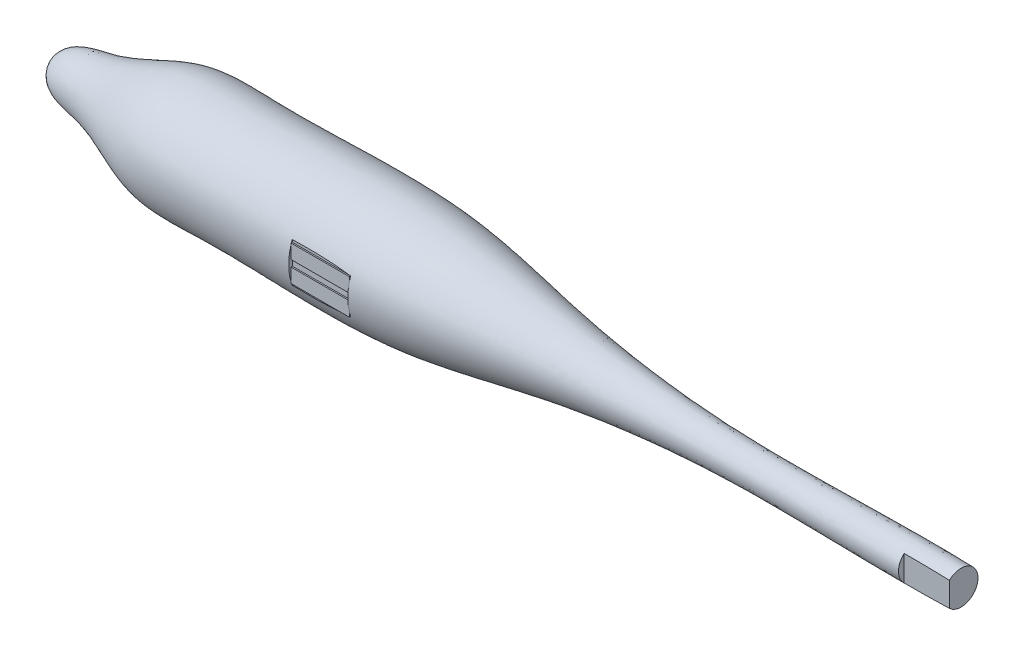
ISO-10303-21;
HEADER;
FILE_DESCRIPTION(('STEP AP214'),'2;1');
FILE_NAME('part.step','',(''),(''),'','','');
FILE_SCHEMA(('AUTOMOTIVE_DESIGN { 1 0 10303 214 1 1 1 1 }'));
ENDSEC;
DATA;
#1=APPLICATION_CONTEXT('core data for automotive mechanical design processes');
#2=APPLICATION_PROTOCOL_DEFINITION('international standard','automotive_design',2000,#1);
#3=PRODUCT_CONTEXT('',#1,'mechanical');
#4=PRODUCT('Part','Part','',(#3));
#5=PRODUCT_RELATED_PRODUCT_CATEGORY('part','',(#4));
#6=PRODUCT_DEFINITION_FORMATION('','',#4);
#7=PRODUCT_DEFINITION_CONTEXT('part definition',#1,'design');
#8=PRODUCT_DEFINITION('design','',#6,#7);
#9=PRODUCT_DEFINITION_SHAPE('','',#8);
#10=(LENGTH_UNIT() NAMED_UNIT(*) SI_UNIT(.MILLI.,.METRE.));
#11=(NAMED_UNIT(*) PLANE_ANGLE_UNIT() SI_UNIT($,.RADIAN.));
#12=(NAMED_UNIT(*) SI_UNIT($,.STERADIAN.) SOLID_ANGLE_UNIT());
#13=UNCERTAINTY_MEASURE_WITH_UNIT(LENGTH_MEASURE(1.E-05),#10,'distance_accuracy_value','');
#14=(GEOMETRIC_REPRESENTATION_CONTEXT(3) GLOBAL_UNCERTAINTY_ASSIGNED_CONTEXT((#13)) GLOBAL_UNIT_ASSIGNED_CONTEXT((#10,
#11,#12)) REPRESENTATION_CONTEXT('',''));
#15=CARTESIAN_POINT('',(0.,0.,0.));
#16=DIRECTION('',(0.,0.,1.));
#17=DIRECTION('',(1.,0.,0.));
#18=AXIS2_PLACEMENT_3D('',#15,#16,#17);
#19=CARTESIAN_POINT('',(450.,100.,81.5));
#20=DIRECTION('',(-1.,0.,0.));
#21=DIRECTION('',(0.,0.,1.));
#22=AXIS2_PLACEMENT_3D('',#19,#20,#21);
#23=PLANE('',#22);
#24=DIRECTION('',(0.,-1.,0.));
#25=VECTOR('',#24,1.);
#26=CARTESIAN_POINT('',(450.,100.,81.5));
#27=LINE('',#26,#25);
#28=CARTESIAN_POINT('',(450.,-27.045196906397,81.5));
#29=VERTEX_POINT('',#28);
#30=CARTESIAN_POINT('',(450.,-30.5882634477406,81.5));
#31=VERTEX_POINT('',#30);
#32=EDGE_CURVE('E250',#29,#31,#27,.T.);
#33=ORIENTED_EDGE('',*,*,#32,.F.);
#34=DIRECTION('',(0.,0.,-1.));
#35=VECTOR('',#34,1.);
#36=CARTESIAN_POINT('',(450.,-27.045196906397,83.5));
#37=LINE('',#36,#35);
#38=CARTESIAN_POINT('',(450.,-27.045196906397,82.7432727479558));
#39=VERTEX_POINT('',#38);
#40=EDGE_CURVE('E195',#39,#29,#37,.T.);
#41=ORIENTED_EDGE('',*,*,#40,.F.);
#42=CARTESIAN_POINT('',(450.,0.,0.));
#43=DIRECTION('',(-1.,0.,0.));
#44=DIRECTION('',(0.,0.,1.));
#45=AXIS2_PLACEMENT_3D('',#42,#43,#44);
#46=CIRCLE('',#45,87.0510876482792);
#47=EDGE_CURVE('E332',#31,#39,#46,.T.);
#48=ORIENTED_EDGE('',*,*,#47,.F.);
#49=EDGE_LOOP('',(#33,#41,#48));
#50=FACE_BOUND('',#49,.T.);
#51=ADVANCED_FACE('F41',(#50),#23,.F.);
#52=CARTESIAN_POINT('',(0.,0.,81.5));
#53=DIRECTION('',(0.,0.,1.));
#54=DIRECTION('',(1.,0.,0.));
#55=AXIS2_PLACEMENT_3D('',#52,#53,#54);
#56=PLANE('',#55);
#57=DIRECTION('',(-1.,0.,0.));
#58=VECTOR('',#57,1.);
#59=CARTESIAN_POINT('',(0.,-27.045196906397,81.5));
#60=LINE('',#59,#58);
#61=CARTESIAN_POINT('',(540.,-27.045196906397,81.5));
#62=VERTEX_POINT('',#61);
#63=EDGE_CURVE('E163',#62,#29,#60,.T.);
#64=ORIENTED_EDGE('',*,*,#63,.T.);
#65=ORIENTED_EDGE('',*,*,#32,.T.);
#66=CARTESIAN_POINT('',(450.,-30.5882634477406,81.5));
#67=CARTESIAN_POINT('',(452.457198671297,-30.6639103386973,81.5));
#68=CARTESIAN_POINT('',(454.914692075629,-30.730601868553,81.5));
#69=CARTESIAN_POINT('',(459.833598865219,-30.8439923269579,81.5));
#70=CARTESIAN_POINT('',(462.295012898266,-30.8906629760494,81.5));
#71=CARTESIAN_POINT('',(467.220732952458,-30.9617415209251,81.5));
#72=CARTESIAN_POINT('',(469.685039318026,-30.9861262031404,81.5));
#73=CARTESIAN_POINT('',(474.615503115998,-31.0102560795772,81.5));
#74=CARTESIAN_POINT('',(477.081660637873,-31.0099840332646,81.5));
#75=CARTESIAN_POINT('',(482.014790302231,-30.9823067466293,81.5));
#76=CARTESIAN_POINT('',(484.481762389277,-30.9548909726234,81.5));
#77=CARTESIAN_POINT('',(489.415485213504,-30.8702653851813,81.5));
#78=CARTESIAN_POINT('',(491.882235894276,-30.8130522093483,81.5));
#79=CARTESIAN_POINT('',(496.801124886324,-30.6663470936197,81.5));
#80=CARTESIAN_POINT('',(499.253268506687,-30.5770355654618,81.5));
#81=CARTESIAN_POINT('',(504.155438957579,-30.3629542677678,81.5));
#82=CARTESIAN_POINT('',(506.605466153147,-30.2381929476772,81.5));
#83=CARTESIAN_POINT('',(511.502419180302,-29.9496859672086,81.5));
#84=CARTESIAN_POINT('',(513.949345776314,-29.7859533919233,81.5));
#85=CARTESIAN_POINT('',(518.839081338774,-29.4154500048722,81.5));
#86=CARTESIAN_POINT('',(521.281891471952,-29.2086947357115,81.5));
#87=CARTESIAN_POINT('',(526.162302672907,-28.7473708205996,81.5));
#88=CARTESIAN_POINT('',(528.599905038913,-28.4928159700545,81.5));
#89=CARTESIAN_POINT('',(533.468829876327,-27.9301127000508,81.5));
#90=CARTESIAN_POINT('',(535.900152816567,-27.6219684063763,81.5));
#91=CARTESIAN_POINT('',(538.606078805002,-27.2445719262848,81.5));
#92=CARTESIAN_POINT('',(538.88492768485,-27.2052720069426,81.5));
#93=CARTESIAN_POINT('',(539.442537523735,-27.1258521572484,81.5));
#94=CARTESIAN_POINT('',(539.721298470969,-27.0857321440459,81.5));
#95=CARTESIAN_POINT('',(540.000000000001,-27.0451969064064,81.5));
#96=B_SPLINE_CURVE_WITH_KNOTS('',3,(#66,#67,#68,#69,#70,#71,#72,#73,#74,#75,#76,#77,#78,#79,#80,
#81,#82,#83,#84,#85,#86,#87,#88,#89,#90,#91,#92,#93,#94,#95),.UNSPECIFIED.,.F.,.F.,(4,2,2,2,2,2,
2,2,2,2,2,2,2,2,4),(0.,7.37510047323654,14.7605842333292,22.1537521422233,29.5520895587556,
36.953299178435,44.3553441460087,51.7164196981508,59.0757422101427,66.432597213453,
73.7867990405656,81.1388816294557,88.4903984410731,89.3352121223248,90.1801115773729),.UNSPECIFIED.);
#97=EDGE_CURVE('E330',#31,#62,#96,.T.);
#98=ORIENTED_EDGE('',*,*,#97,.T.);
#99=EDGE_LOOP('',(#64,#65,#98));
#100=FACE_BOUND('',#99,.T.);
#101=ADVANCED_FACE('F296',(#100),#56,.T.);
#102=CARTESIAN_POINT('',(540.,100.,81.5));
#103=DIRECTION('',(1.,0.,0.));
#104=DIRECTION('',(0.,0.,-1.));
#105=AXIS2_PLACEMENT_3D('',#102,#103,#104);
#106=PLANE('',#105);
#107=DIRECTION('',(0.,1.,0.));
#108=VECTOR('',#107,1.);
#109=CARTESIAN_POINT('',(540.,100.,81.5));
#110=LINE('',#109,#108);
#111=CARTESIAN_POINT('',(540.,-5.,81.5));
#112=VERTEX_POINT('',#111);
#113=CARTESIAN_POINT('',(540.,5.,81.5));
#114=VERTEX_POINT('',#113);
#115=EDGE_CURVE('E247',#112,#114,#110,.T.);
#116=ORIENTED_EDGE('',*,*,#115,.F.);
#117=DIRECTION('',(0.,0.,-1.));
#118=VECTOR('',#117,1.);
#119=CARTESIAN_POINT('',(540.,-5.,83.5));
#120=LINE('',#119,#118);
#121=CARTESIAN_POINT('',(540.,-5.,83.5));
#122=VERTEX_POINT('',#121);
#123=EDGE_CURVE('E168',#122,#112,#120,.T.);
#124=ORIENTED_EDGE('',*,*,#123,.F.);
#125=DIRECTION('',(0.,1.,0.));
#126=VECTOR('',#125,1.);
#127=CARTESIAN_POINT('',(540.,0.,83.5));
#128=LINE('',#127,#126);
#129=CARTESIAN_POINT('',(540.,-20.0360344306466,83.5));
#130=VERTEX_POINT('',#129);
#131=EDGE_CURVE('E177',#130,#122,#128,.T.);
#132=ORIENTED_EDGE('',*,*,#131,.F.);
#133=CARTESIAN_POINT('',(540.,0.,0.));
#134=DIRECTION('',(-1.,0.,0.));
#135=DIRECTION('',(0.,0.,1.));
#136=AXIS2_PLACEMENT_3D('',#133,#134,#135);
#137=CIRCLE('',#136,85.8702083129318);
#138=CARTESIAN_POINT('',(540.,20.0360344306528,83.5));
#139=VERTEX_POINT('',#138);
#140=EDGE_CURVE('E552',#139,#130,#137,.F.);
#141=ORIENTED_EDGE('',*,*,#140,.F.);
#142=DIRECTION('',(0.,1.,0.));
#143=VECTOR('',#142,1.);
#144=CARTESIAN_POINT('',(540.,0.,83.5));
#145=LINE('',#144,#143);
#146=CARTESIAN_POINT('',(540.,5.,83.5));
#147=VERTEX_POINT('',#146);
#148=EDGE_CURVE('E207',#147,#139,#145,.T.);
#149=ORIENTED_EDGE('',*,*,#148,.F.);
#150=DIRECTION('',(0.,0.,-1.));
#151=VECTOR('',#150,1.);
#152=CARTESIAN_POINT('',(540.,5.,83.5));
#153=LINE('',#152,#151);
#154=EDGE_CURVE('E223',#147,#114,#153,.T.);
#155=ORIENTED_EDGE('',*,*,#154,.T.);
#156=EDGE_LOOP('',(#116,#124,#132,#141,#149,#155));
#157=FACE_BOUND('',#156,.T.);
#158=ADVANCED_FACE('F281',(#157),#106,.F.);
#159=DIRECTION('',(0.,0.,-1.));
#160=VECTOR('',#159,1.);
#161=CARTESIAN_POINT('',(450.,27.0451969064018,83.5));
#162=LINE('',#161,#160);
#163=CARTESIAN_POINT('',(450.,27.0451969064018,82.7432727479558));
#164=VERTEX_POINT('',#163);
#165=CARTESIAN_POINT('',(450.,27.0451969064018,81.5));
#166=VERTEX_POINT('',#165);
#167=EDGE_CURVE('E234',#164,#166,#162,.T.);
#168=ORIENTED_EDGE('',*,*,#167,.T.);
#169=CARTESIAN_POINT('',(450.,30.5882634477406,81.5));
#170=VERTEX_POINT('',#169);
#171=EDGE_CURVE('E251',#170,#166,#27,.T.);
#172=ORIENTED_EDGE('',*,*,#171,.F.);
#173=EDGE_CURVE('E317',#164,#170,#46,.T.);
#174=ORIENTED_EDGE('',*,*,#173,.F.);
#175=EDGE_LOOP('',(#168,#172,#174));
#176=FACE_BOUND('',#175,.T.);
#177=ADVANCED_FACE('F299',(#176),#23,.F.);
#178=DIRECTION('',(0.,-1.,0.));
#179=VECTOR('',#178,1.);
#180=CARTESIAN_POINT('',(450.,0.,83.5));
#181=LINE('',#180,#179);
#182=CARTESIAN_POINT('',(450.,-5.,83.5));
#183=VERTEX_POINT('',#182);
#184=CARTESIAN_POINT('',(450.,-24.6097919688157,83.5));
#185=VERTEX_POINT('',#184);
#186=EDGE_CURVE('E64',#183,#185,#181,.T.);
#187=ORIENTED_EDGE('',*,*,#186,.F.);
#188=DIRECTION('',(0.,0.,-1.));
#189=VECTOR('',#188,1.);
#190=CARTESIAN_POINT('',(450.,-5.,83.5));
#191=LINE('',#190,#189);
#192=CARTESIAN_POINT('',(450.,-5.,81.5));
#193=VERTEX_POINT('',#192);
#194=EDGE_CURVE('E201',#183,#193,#191,.T.);
#195=ORIENTED_EDGE('',*,*,#194,.T.);
#196=CARTESIAN_POINT('',(450.,5.,81.5));
#197=VERTEX_POINT('',#196);
#198=EDGE_CURVE('E256',#197,#193,#27,.T.);
#199=ORIENTED_EDGE('',*,*,#198,.F.);
#200=DIRECTION('',(0.,0.,-1.));
#201=VECTOR('',#200,1.);
#202=CARTESIAN_POINT('',(450.,5.,83.5));
#203=LINE('',#202,#201);
#204=CARTESIAN_POINT('',(450.,5.,83.5));
#205=VERTEX_POINT('',#204);
#206=EDGE_CURVE('E72',#205,#197,#203,.T.);
#207=ORIENTED_EDGE('',*,*,#206,.F.);
#208=DIRECTION('',(0.,-1.,0.));
#209=VECTOR('',#208,1.);
#210=CARTESIAN_POINT('',(450.,0.,83.5));
#211=LINE('',#210,#209);
#212=CARTESIAN_POINT('',(450.,24.6097919688157,83.5));
#213=VERTEX_POINT('',#212);
#214=EDGE_CURVE('E215',#213,#205,#211,.T.);
#215=ORIENTED_EDGE('',*,*,#214,.F.);
#216=EDGE_CURVE('E329',#185,#213,#46,.T.);
#217=ORIENTED_EDGE('',*,*,#216,.F.);
#218=EDGE_LOOP('',(#187,#195,#199,#207,#215,#217));
#219=FACE_BOUND('',#218,.T.);
#220=ADVANCED_FACE('F298',(#219),#23,.F.);
#221=ORIENTED_EDGE('',*,*,#171,.T.);
#222=DIRECTION('',(-1.,-1.06589120246131E-13,0.));
#223=VECTOR('',#222,1.);
#224=CARTESIAN_POINT('',(-2.88272374513111E-12,27.045196906349,81.5));
#225=LINE('',#224,#223);
#226=CARTESIAN_POINT('',(540.,27.0451969064066,81.5));
#227=VERTEX_POINT('',#226);
#228=EDGE_CURVE('E167',#227,#166,#225,.T.);
#229=ORIENTED_EDGE('',*,*,#228,.F.);
#230=CARTESIAN_POINT('',(540.,27.0451969064066,81.5));
#231=CARTESIAN_POINT('',(538.757491753603,27.2258864113611,81.5));
#232=CARTESIAN_POINT('',(537.51380653857,27.3983822633236,81.5));
#233=CARTESIAN_POINT('',(535.024421420635,27.7279571685608,81.5));
#234=CARTESIAN_POINT('',(533.778721563648,27.8850365682976,81.5));
#235=CARTESIAN_POINT('',(531.287441475227,28.1845345933884,81.5));
#236=CARTESIAN_POINT('',(530.041863812628,28.3269746413436,81.5));
#237=CARTESIAN_POINT('',(527.549231015419,28.5982956183902,81.5));
#238=CARTESIAN_POINT('',(526.302175871544,28.7271764619933,81.5));
#239=CARTESIAN_POINT('',(522.561491258923,29.0944158404513,81.5));
#240=CARTESIAN_POINT('',(520.065967067639,29.3136536538018,81.5));
#241=CARTESIAN_POINT('',(515.072733065409,29.7063056210771,81.5));
#242=CARTESIAN_POINT('',(512.575025176745,29.8797445896941,81.5));
#243=CARTESIAN_POINT('',(507.577755304505,30.1853699541736,81.5));
#244=CARTESIAN_POINT('',(505.078193971863,30.3175670643117,81.5));
#245=CARTESIAN_POINT('',(500.077536395577,30.5446176460442,81.5));
#246=CARTESIAN_POINT('',(497.576440246144,30.639473217057,81.5));
#247=CARTESIAN_POINT('',(492.574624270357,30.7952004405022,81.5));
#248=CARTESIAN_POINT('',(490.073905035148,30.8560913374543,81.5));
#249=CARTESIAN_POINT('',(485.071087568977,30.9470251478579,81.5));
#250=CARTESIAN_POINT('',(482.568989155788,30.9770578173393,81.5));
#251=CARTESIAN_POINT('',(477.563401893861,31.0090199546232,81.5));
#252=CARTESIAN_POINT('',(475.059912962439,31.0109357012117,81.5));
#253=CARTESIAN_POINT('',(470.051533852554,30.9891911814569,81.5));
#254=CARTESIAN_POINT('',(467.546643746247,30.9655153850131,81.5));
#255=CARTESIAN_POINT('',(462.53545648098,30.894962357243,81.5));
#256=CARTESIAN_POINT('',(460.029159555983,30.8480689907324,81.5));
#257=CARTESIAN_POINT('',(455.015138949253,30.7333234678113,81.5));
#258=CARTESIAN_POINT('',(452.507415628535,30.6654554298763,81.5));
#259=CARTESIAN_POINT('',(450.,30.5882634477407,81.5));
#260=B_SPLINE_CURVE_WITH_KNOTS('',3,(#230,#231,#232,#233,#234,#235,#236,#237,#238,#239,#240,
#241,#242,#243,#244,#245,#246,#247,#248,#249,#250,#251,#252,#253,#254,#255,#256,#257,#258,#259),
.UNSPECIFIED.,.F.,.F.,(4,2,2,2,2,2,2,2,2,2,2,2,2,2,4),(0.,3.76668456807292,7.53328446601633,
11.2942915610244,15.0553223670694,22.5702085897416,30.0810147094091,37.589867959092,
45.0982989852087,52.6024713716136,60.1091341053487,67.6194600102788,75.1343460791425,
82.6544620074198,90.1802859979726),.UNSPECIFIED.);
#261=EDGE_CURVE('E11',#227,#170,#260,.T.);
#262=ORIENTED_EDGE('',*,*,#261,.T.);
#263=EDGE_LOOP('',(#221,#229,#262));
#264=FACE_BOUND('',#263,.T.);
#265=ADVANCED_FACE('F304',(#264),#56,.T.);
#266=DIRECTION('',(1.,0.,0.));
#267=VECTOR('',#266,1.);
#268=CARTESIAN_POINT('',(0.,-5.00000000000004,81.5));
#269=LINE('',#268,#267);
#270=EDGE_CURVE('E183',#193,#112,#269,.T.);
#271=ORIENTED_EDGE('',*,*,#270,.T.);
#272=ORIENTED_EDGE('',*,*,#115,.T.);
#273=DIRECTION('',(1.,0.,0.));
#274=VECTOR('',#273,1.);
#275=CARTESIAN_POINT('',(0.,5.,81.5));
#276=LINE('',#275,#274);
#277=EDGE_CURVE('E226',#197,#114,#276,.T.);
#278=ORIENTED_EDGE('',*,*,#277,.F.);
#279=ORIENTED_EDGE('',*,*,#198,.T.);
#280=EDGE_LOOP('',(#271,#272,#278,#279));
#281=FACE_BOUND('',#280,.T.);
#282=ADVANCED_FACE('F292',(#281),#56,.T.);
#283=CARTESIAN_POINT('',(1400.,25.9970145755801,0.));
#284=CARTESIAN_POINT('',(1281.14971177716,28.8593200364867,0.));
#285=CARTESIAN_POINT('',(1072.41205954048,17.7479026178776,0.));
#286=CARTESIAN_POINT('',(802.56682911876,43.0656195642837,0.));
#287=CARTESIAN_POINT('',(551.199038272491,98.1902962667587,0.));
#288=CARTESIAN_POINT('',(355.22981013099,80.4634683007193,0.));
#289=CARTESIAN_POINT('',(174.285504865442,89.8849278818885,0.));
#290=CARTESIAN_POINT('',(87.5704454379826,35.9799936338791,0.));
#291=CARTESIAN_POINT('',(6.00786283858145,35.1205413599214,0.));
#292=CARTESIAN_POINT('',(0.,0.,0.));
#293=B_SPLINE_CURVE_WITH_KNOTS('',3,(#283,#284,#285,#286,#287,#288,#289,#290,#291,#292),
.UNSPECIFIED.,.F.,.F.,(4,1,1,1,1,1,1,4),(0.,0.249880198351159,0.438138676150039,
0.568583185883452,0.786811393070756,0.852677505246597,0.939091247792434,1.),.UNSPECIFIED.);
#294=CARTESIAN_POINT('',(0.,0.,0.));
#295=DIRECTION('',(-1.,0.,0.));
#296=AXIS1_PLACEMENT('',#294,#295);
#297=SURFACE_OF_REVOLUTION('',#293,#296);
#298=CARTESIAN_POINT('',(1400.,18.7575256055516,18.));
#299=CARTESIAN_POINT('',(1397.11166502373,18.8539183075252,18.));
#300=CARTESIAN_POINT('',(1394.22307374092,18.9424591516889,18.));
#301=CARTESIAN_POINT('',(1388.44551001591,19.1048427477184,18.));
#302=CARTESIAN_POINT('',(1385.55653757842,19.1786856663234,18.));
#303=CARTESIAN_POINT('',(1379.7782845259,19.3126810121057,18.));
#304=CARTESIAN_POINT('',(1376.88900391164,19.372833472781,18.));
#305=CARTESIAN_POINT('',(1371.11047242964,19.4803633324053,18.));
#306=CARTESIAN_POINT('',(1368.22122158369,19.5277419080548,18.));
#307=CARTESIAN_POINT('',(1362.44254431672,19.6106059599537,18.));
#308=CARTESIAN_POINT('',(1359.55311789534,19.6460914103955,18.));
#309=CARTESIAN_POINT('',(1353.7741550302,19.706000598121,18.));
#310=CARTESIAN_POINT('',(1350.88461858658,19.7304243495229,18.));
#311=CARTESIAN_POINT('',(1345.01288129232,19.7696293983369,18.));
#312=CARTESIAN_POINT('',(1342.03067824911,19.7840766199316,18.));
#313=CARTESIAN_POINT('',(1336.06614369288,19.8028874988157,18.));
#314=CARTESIAN_POINT('',(1333.08381217882,19.8072508308463,18.));
#315=CARTESIAN_POINT('',(1330.10148425026,19.8069944446794,18.));
#316=B_SPLINE_CURVE_WITH_KNOTS('',3,(#298,#299,#300,#301,#302,#303,#304,#305,#306,#307,#308,
#309,#310,#311,#312,#313,#314,#315),.UNSPECIFIED.,.F.,.F.,(4,2,2,2,2,2,2,2,4),(0.,
8.66980992863668,17.3395214978894,26.0092118538671,34.6781033051005,43.3470135673356,
52.015912765352,60.9626092112307,69.9095942314024),.UNSPECIFIED.);
#317=CARTESIAN_POINT('',(1400.,18.7575256055517,18.));
#318=VERTEX_POINT('',#317);
#319=CARTESIAN_POINT('',(1330.10148425026,19.8069944446794,18.));
#320=VERTEX_POINT('',#319);
#321=EDGE_CURVE('E268',#318,#320,#316,.T.);
#322=ORIENTED_EDGE('',*,*,#321,.F.);
#323=CARTESIAN_POINT('',(1400.,0.,0.));
#324=DIRECTION('',(-1.,0.,0.));
#325=DIRECTION('',(0.,0.,1.));
#326=AXIS2_PLACEMENT_3D('',#323,#324,#325);
#327=CIRCLE('',#326,25.9970145755801);
#328=CARTESIAN_POINT('',(1400.,-18.7575256055517,18.));
#329=VERTEX_POINT('',#328);
#330=EDGE_CURVE('E358',#318,#329,#327,.T.);
#331=ORIENTED_EDGE('',*,*,#330,.T.);
#332=CARTESIAN_POINT('',(1330.10148425026,-19.8069944446794,18.));
#333=CARTESIAN_POINT('',(1333.06487366827,-19.8072493053307,18.));
#334=CARTESIAN_POINT('',(1336.02826649321,-19.8029427966421,18.));
#335=CARTESIAN_POINT('',(1341.95506831325,-19.7843780633961,18.));
#336=CARTESIAN_POINT('',(1344.91847730783,-19.7701196782971,18.));
#337=CARTESIAN_POINT('',(1350.84524205187,-19.7308220416558,18.));
#338=CARTESIAN_POINT('',(1353.80859780094,-19.7057827288395,18.));
#339=CARTESIAN_POINT('',(1359.73483706334,-19.6440632082898,18.));
#340=CARTESIAN_POINT('',(1362.69772059096,-19.6073843837587,18.));
#341=CARTESIAN_POINT('',(1368.62329193559,-19.5214874362431,18.));
#342=CARTESIAN_POINT('',(1371.58597975354,-19.4722693778308,18.));
#343=CARTESIAN_POINT('',(1377.51108779537,-19.3603490146501,18.));
#344=CARTESIAN_POINT('',(1380.47350802049,-19.2976467753008,18.));
#345=CARTESIAN_POINT('',(1386.19676820984,-19.1625117565108,18.));
#346=CARTESIAN_POINT('',(1388.95763051047,-19.091029399063,18.));
#347=CARTESIAN_POINT('',(1394.47907333238,-18.9345981012572,18.));
#348=CARTESIAN_POINT('',(1397.23965383977,-18.8496486712949,18.));
#349=CARTESIAN_POINT('',(1400.,-18.7575256055517,18.));
#350=B_SPLINE_CURVE_WITH_KNOTS('',3,(#332,#333,#334,#335,#336,#337,#338,#339,#340,#341,#342,
#343,#344,#345,#346,#347,#348,#349),.UNSPECIFIED.,.F.,.F.,(4,2,2,2,2,2,2,2,4),(0.,
8.89016924959415,17.7804819169279,26.6708451135442,35.5601522032667,44.4494135173852,
53.3386317058841,61.6239625031813,69.9095945882815),.UNSPECIFIED.);
#351=CARTESIAN_POINT('',(1330.10148425026,-19.8069944446794,18.));
#352=VERTEX_POINT('',#351);
#353=EDGE_CURVE('E260',#352,#329,#350,.T.);
#354=ORIENTED_EDGE('',*,*,#353,.F.);
#355=CARTESIAN_POINT('',(1330.10148425026,0.,0.));
#356=DIRECTION('',(-1.,0.,0.));
#357=DIRECTION('',(0.,0.,1.));
#358=AXIS2_PLACEMENT_3D('',#355,#356,#357);
#359=CIRCLE('',#358,26.7640996286361);
#360=EDGE_CURVE('E337',#352,#320,#359,.T.);
#361=ORIENTED_EDGE('',*,*,#360,.T.);
#362=EDGE_LOOP('',(#322,#331,#354,#361));
#363=FACE_BOUND('',#362,.T.);
#364=CARTESIAN_POINT('',(0.,0.,0.));
#365=VERTEX_POINT('',#364);
#366=VERTEX_LOOP('',#365);
#367=FACE_BOUND('',#366,.T.);
#368=ORIENTED_EDGE('',*,*,#261,.F.);
#369=EDGE_CURVE('E57',#227,#139,#137,.F.);
#370=ORIENTED_EDGE('',*,*,#369,.T.);
#371=ORIENTED_EDGE('',*,*,#140,.T.);
#372=EDGE_CURVE('E173',#130,#62,#137,.F.);
#373=ORIENTED_EDGE('',*,*,#372,.T.);
#374=ORIENTED_EDGE('',*,*,#97,.F.);
#375=ORIENTED_EDGE('',*,*,#47,.T.);
#376=EDGE_CURVE('E333',#39,#185,#46,.T.);
#377=ORIENTED_EDGE('',*,*,#376,.T.);
#378=ORIENTED_EDGE('',*,*,#216,.T.);
#379=CARTESIAN_POINT('',(450.,0.,0.));
#380=DIRECTION('',(-1.,0.,0.));
#381=DIRECTION('',(0.,0.,1.));
#382=AXIS2_PLACEMENT_3D('',#379,#380,#381);
#383=CIRCLE('',#382,87.0510876482792);
#384=EDGE_CURVE('E243',#164,#213,#383,.F.);
#385=ORIENTED_EDGE('',*,*,#384,.F.);
#386=ORIENTED_EDGE('',*,*,#173,.T.);
#387=EDGE_LOOP('',(#368,#370,#371,#373,#374,#375,#377,#378,#385,#386));
#388=FACE_BOUND('',#387,.T.);
#389=ADVANCED_FACE('F43',(#363,#367,#388),#297,.T.);
#390=CARTESIAN_POINT('',(1400.,0.,0.));
#391=DIRECTION('',(-1.,0.,0.));
#392=DIRECTION('',(0.,0.,1.));
#393=AXIS2_PLACEMENT_3D('',#390,#391,#392);
#394=PLANE('',#393);
#395=DIRECTION('',(0.,1.,0.));
#396=VECTOR('',#395,1.);
#397=CARTESIAN_POINT('',(1400.,0.,18.));
#398=LINE('',#397,#396);
#399=EDGE_CURVE('E361',#329,#318,#398,.T.);
#400=ORIENTED_EDGE('',*,*,#399,.F.);
#401=ORIENTED_EDGE('',*,*,#330,.F.);
#402=EDGE_LOOP('',(#400,#401));
#403=FACE_BOUND('',#402,.T.);
#404=ADVANCED_FACE('F285',(#403),#394,.F.);
#405=CARTESIAN_POINT('',(1330.10148425026,25.,18.));
#406=DIRECTION('',(-1.,0.,0.));
#407=DIRECTION('',(0.,0.,1.));
#408=AXIS2_PLACEMENT_3D('',#405,#406,#407);
#409=PLANE('',#408);
#410=DIRECTION('',(0.,-1.,0.));
#411=VECTOR('',#410,1.);
#412=CARTESIAN_POINT('',(1330.10148425026,25.,18.));
#413=LINE('',#412,#411);
#414=EDGE_CURVE('E255',#320,#352,#413,.T.);
#415=ORIENTED_EDGE('',*,*,#414,.F.);
#416=ORIENTED_EDGE('',*,*,#360,.F.);
#417=EDGE_LOOP('',(#415,#416));
#418=FACE_BOUND('',#417,.T.);
#419=ADVANCED_FACE('F279',(#418),#409,.F.);
#420=CARTESIAN_POINT('',(0.,0.,18.));
#421=DIRECTION('',(0.,0.,1.));
#422=DIRECTION('',(1.,0.,0.));
#423=AXIS2_PLACEMENT_3D('',#420,#421,#422);
#424=PLANE('',#423);
#425=ORIENTED_EDGE('',*,*,#321,.T.);
#426=ORIENTED_EDGE('',*,*,#414,.T.);
#427=ORIENTED_EDGE('',*,*,#353,.T.);
#428=ORIENTED_EDGE('',*,*,#399,.T.);
#429=EDGE_LOOP('',(#425,#426,#427,#428));
#430=FACE_BOUND('',#429,.T.);
#431=ADVANCED_FACE('F273',(#430),#424,.T.);
#432=CARTESIAN_POINT('',(540.,0.,83.5));
#433=DIRECTION('',(-1.,0.,0.));
#434=DIRECTION('',(0.,0.,1.));
#435=AXIS2_PLACEMENT_3D('',#432,#433,#434);
#436=PLANE('',#435);
#437=CARTESIAN_POINT('',(540.,27.0451969064066,83.5));
#438=VERTEX_POINT('',#437);
#439=EDGE_CURVE('E212',#139,#438,#145,.T.);
#440=ORIENTED_EDGE('',*,*,#439,.F.);
#441=ORIENTED_EDGE('',*,*,#369,.F.);
#442=DIRECTION('',(0.,0.,-1.));
#443=VECTOR('',#442,1.);
#444=CARTESIAN_POINT('',(540.,27.0451969064066,83.5));
#445=LINE('',#444,#443);
#446=EDGE_CURVE('E239',#438,#227,#445,.T.);
#447=ORIENTED_EDGE('',*,*,#446,.F.);
#448=EDGE_LOOP('',(#440,#441,#447));
#449=FACE_BOUND('',#448,.T.);
#450=ADVANCED_FACE('F278',(#449),#436,.F.);
#451=CARTESIAN_POINT('',(450.,0.,83.5));
#452=DIRECTION('',(1.,0.,0.));
#453=DIRECTION('',(0.,0.,-1.));
#454=AXIS2_PLACEMENT_3D('',#451,#452,#453);
#455=PLANE('',#454);
#456=CARTESIAN_POINT('',(450.,27.0451969064018,83.5));
#457=VERTEX_POINT('',#456);
#458=EDGE_CURVE('E235',#457,#164,#162,.T.);
#459=ORIENTED_EDGE('',*,*,#458,.T.);
#460=ORIENTED_EDGE('',*,*,#384,.T.);
#461=EDGE_CURVE('E216',#457,#213,#211,.T.);
#462=ORIENTED_EDGE('',*,*,#461,.F.);
#463=EDGE_LOOP('',(#459,#460,#462));
#464=FACE_BOUND('',#463,.T.);
#465=ADVANCED_FACE('F379',(#464),#455,.F.);
#466=CARTESIAN_POINT('',(-2.88272374513111E-12,27.045196906349,83.5));
#467=DIRECTION('',(1.06589120246131E-13,-1.,0.));
#468=DIRECTION('',(1.,1.06589120246131E-13,0.));
#469=AXIS2_PLACEMENT_3D('',#466,#467,#468);
#470=PLANE('',#469);
#471=ORIENTED_EDGE('',*,*,#228,.T.);
#472=ORIENTED_EDGE('',*,*,#167,.F.);
#473=ORIENTED_EDGE('',*,*,#458,.F.);
#474=DIRECTION('',(-1.,-1.06589120246131E-13,0.));
#475=VECTOR('',#474,1.);
#476=CARTESIAN_POINT('',(-2.88272374513111E-12,27.045196906349,83.5));
#477=LINE('',#476,#475);
#478=EDGE_CURVE('E211',#438,#457,#477,.T.);
#479=ORIENTED_EDGE('',*,*,#478,.F.);
#480=ORIENTED_EDGE('',*,*,#446,.T.);
#481=EDGE_LOOP('',(#471,#472,#473,#479,#480));
#482=FACE_BOUND('',#481,.T.);
#483=ADVANCED_FACE('F381',(#482),#470,.F.);
#484=CARTESIAN_POINT('',(0.,5.,83.5));
#485=DIRECTION('',(0.,1.,0.));
#486=DIRECTION('',(0.,0.,1.));
#487=AXIS2_PLACEMENT_3D('',#484,#485,#486);
#488=PLANE('',#487);
#489=ORIENTED_EDGE('',*,*,#277,.T.);
#490=ORIENTED_EDGE('',*,*,#154,.F.);
#491=DIRECTION('',(1.,0.,0.));
#492=VECTOR('',#491,1.);
#493=CARTESIAN_POINT('',(0.,5.,83.5));
#494=LINE('',#493,#492);
#495=EDGE_CURVE('E220',#205,#147,#494,.T.);
#496=ORIENTED_EDGE('',*,*,#495,.F.);
#497=ORIENTED_EDGE('',*,*,#206,.T.);
#498=EDGE_LOOP('',(#489,#490,#496,#497));
#499=FACE_BOUND('',#498,.T.);
#500=ADVANCED_FACE('F384',(#499),#488,.F.);
#501=CARTESIAN_POINT('',(0.,0.,83.5));
#502=DIRECTION('',(0.,0.,1.));
#503=DIRECTION('',(1.,0.,0.));
#504=AXIS2_PLACEMENT_3D('',#501,#502,#503);
#505=PLANE('',#504);
#506=ORIENTED_EDGE('',*,*,#148,.T.);
#507=ORIENTED_EDGE('',*,*,#439,.T.);
#508=ORIENTED_EDGE('',*,*,#478,.T.);
#509=ORIENTED_EDGE('',*,*,#461,.T.);
#510=ORIENTED_EDGE('',*,*,#214,.T.);
#511=ORIENTED_EDGE('',*,*,#495,.T.);
#512=EDGE_LOOP('',(#506,#507,#508,#509,#510,#511));
#513=FACE_BOUND('',#512,.T.);
#514=ADVANCED_FACE('F390',(#513),#505,.T.);
#515=CARTESIAN_POINT('',(0.,-27.045196906397,83.5));
#516=DIRECTION('',(0.,-1.,0.));
#517=DIRECTION('',(0.,0.,-1.));
#518=AXIS2_PLACEMENT_3D('',#515,#516,#517);
#519=PLANE('',#518);
#520=ORIENTED_EDGE('',*,*,#63,.F.);
#521=DIRECTION('',(0.,0.,-1.));
#522=VECTOR('',#521,1.);
#523=CARTESIAN_POINT('',(540.,-27.045196906397,83.5));
#524=LINE('',#523,#522);
#525=CARTESIAN_POINT('',(540.,-27.045196906397,83.5));
#526=VERTEX_POINT('',#525);
#527=EDGE_CURVE('E156',#526,#62,#524,.T.);
#528=ORIENTED_EDGE('',*,*,#527,.F.);
#529=DIRECTION('',(-1.,0.,0.));
#530=VECTOR('',#529,1.);
#531=CARTESIAN_POINT('',(0.,-27.045196906397,83.5));
#532=LINE('',#531,#530);
#533=CARTESIAN_POINT('',(450.,-27.045196906397,83.5));
#534=VERTEX_POINT('',#533);
#535=EDGE_CURVE('E161',#526,#534,#532,.T.);
#536=ORIENTED_EDGE('',*,*,#535,.T.);
#537=EDGE_CURVE('E198',#534,#39,#37,.T.);
#538=ORIENTED_EDGE('',*,*,#537,.T.);
#539=ORIENTED_EDGE('',*,*,#40,.T.);
#540=EDGE_LOOP('',(#520,#528,#536,#538,#539));
#541=FACE_BOUND('',#540,.T.);
#542=ADVANCED_FACE('F158',(#541),#519,.T.);
#543=CARTESIAN_POINT('',(540.,0.,83.5));
#544=DIRECTION('',(-1.,0.,0.));
#545=DIRECTION('',(0.,0.,1.));
#546=AXIS2_PLACEMENT_3D('',#543,#544,#545);
#547=PLANE('',#546);
#548=ORIENTED_EDGE('',*,*,#527,.T.);
#549=ORIENTED_EDGE('',*,*,#372,.F.);
#550=EDGE_CURVE('E171',#526,#130,#128,.T.);
#551=ORIENTED_EDGE('',*,*,#550,.F.);
#552=EDGE_LOOP('',(#548,#549,#551));
#553=FACE_BOUND('',#552,.T.);
#554=ADVANCED_FACE('F172',(#553),#547,.F.);
#555=CARTESIAN_POINT('',(0.,-5.00000000000004,83.5));
#556=DIRECTION('',(0.,1.,0.));
#557=DIRECTION('',(-1.,0.,0.));
#558=AXIS2_PLACEMENT_3D('',#555,#556,#557);
#559=PLANE('',#558);
#560=ORIENTED_EDGE('',*,*,#270,.F.);
#561=ORIENTED_EDGE('',*,*,#194,.F.);
#562=DIRECTION('',(1.,0.,0.));
#563=VECTOR('',#562,1.);
#564=CARTESIAN_POINT('',(0.,-5.00000000000004,83.5));
#565=LINE('',#564,#563);
#566=EDGE_CURVE('E176',#183,#122,#565,.T.);
#567=ORIENTED_EDGE('',*,*,#566,.T.);
#568=ORIENTED_EDGE('',*,*,#123,.T.);
#569=EDGE_LOOP('',(#560,#561,#567,#568));
#570=FACE_BOUND('',#569,.T.);
#571=ADVANCED_FACE('F398',(#570),#559,.T.);
#572=CARTESIAN_POINT('',(450.,0.,83.5));
#573=DIRECTION('',(1.,0.,0.));
#574=DIRECTION('',(0.,0.,-1.));
#575=AXIS2_PLACEMENT_3D('',#572,#573,#574);
#576=PLANE('',#575);
#577=EDGE_CURVE('E180',#185,#534,#181,.T.);
#578=ORIENTED_EDGE('',*,*,#577,.F.);
#579=ORIENTED_EDGE('',*,*,#376,.F.);
#580=ORIENTED_EDGE('',*,*,#537,.F.);
#581=EDGE_LOOP('',(#578,#579,#580));
#582=FACE_BOUND('',#581,.T.);
#583=ADVANCED_FACE('F347',(#582),#576,.F.);
#584=CARTESIAN_POINT('',(0.,0.,83.5));
#585=DIRECTION('',(0.,0.,1.));
#586=DIRECTION('',(1.,0.,0.));
#587=AXIS2_PLACEMENT_3D('',#584,#585,#586);
#588=PLANE('',#587);
#589=ORIENTED_EDGE('',*,*,#535,.F.);
#590=ORIENTED_EDGE('',*,*,#550,.T.);
#591=ORIENTED_EDGE('',*,*,#131,.T.);
#592=ORIENTED_EDGE('',*,*,#566,.F.);
#593=ORIENTED_EDGE('',*,*,#186,.T.);
#594=ORIENTED_EDGE('',*,*,#577,.T.);
#595=EDGE_LOOP('',(#589,#590,#591,#592,#593,#594));
#596=FACE_BOUND('',#595,.T.);
#597=ADVANCED_FACE('F179',(#596),#588,.T.);
#598=CLOSED_SHELL('',(#51,#101,#158,#177,#220,#265,#282,#389,#404,#419,#431,#450,#465,#483,#500,
#514,#542,#554,#571,#583,#597));
#599=MANIFOLD_SOLID_BREP('B2',#598);
#600=ADVANCED_BREP_SHAPE_REPRESENTATION('',(#18,#599),#14);
#601=SHAPE_DEFINITION_REPRESENTATION(#9,#600);
ENDSEC;
END-ISO-10303-21;
